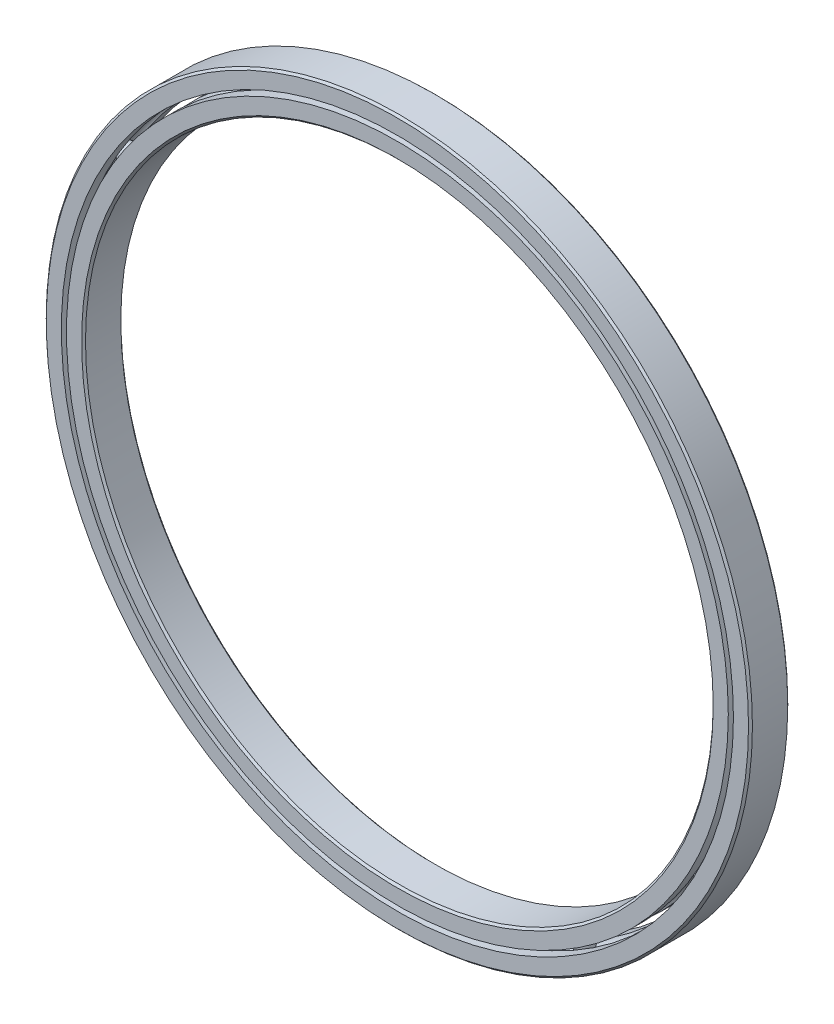
ISO-10303-21;
HEADER;
FILE_DESCRIPTION(('STEP AP214'),'2;1');
FILE_NAME('part.step','',(''),(''),'','','');
FILE_SCHEMA(('AUTOMOTIVE_DESIGN { 1 0 10303 214 1 1 1 1 }'));
ENDSEC;
DATA;
#1=APPLICATION_CONTEXT('core data for automotive mechanical design processes');
#2=APPLICATION_PROTOCOL_DEFINITION('international standard','automotive_design',2000,#1);
#3=PRODUCT_CONTEXT('',#1,'mechanical');
#4=PRODUCT('Part','Part','',(#3));
#5=PRODUCT_RELATED_PRODUCT_CATEGORY('part','',(#4));
#6=PRODUCT_DEFINITION_FORMATION('','',#4);
#7=PRODUCT_DEFINITION_CONTEXT('part definition',#1,'design');
#8=PRODUCT_DEFINITION('design','',#6,#7);
#9=PRODUCT_DEFINITION_SHAPE('','',#8);
#10=(LENGTH_UNIT() NAMED_UNIT(*) SI_UNIT(.MILLI.,.METRE.));
#11=(NAMED_UNIT(*) PLANE_ANGLE_UNIT() SI_UNIT($,.RADIAN.));
#12=(NAMED_UNIT(*) SI_UNIT($,.STERADIAN.) SOLID_ANGLE_UNIT());
#13=UNCERTAINTY_MEASURE_WITH_UNIT(LENGTH_MEASURE(1.E-05),#10,'distance_accuracy_value','');
#14=(GEOMETRIC_REPRESENTATION_CONTEXT(3) GLOBAL_UNCERTAINTY_ASSIGNED_CONTEXT((#13)) GLOBAL_UNIT_ASSIGNED_CONTEXT((#10,
#11,#12)) REPRESENTATION_CONTEXT('',''));
#15=CARTESIAN_POINT('',(0.,0.,0.));
#16=DIRECTION('',(0.,0.,1.));
#17=DIRECTION('',(1.,0.,0.));
#18=AXIS2_PLACEMENT_3D('',#15,#16,#17);
#19=CARTESIAN_POINT('',(-26.9874999999994,46.7437211692654,0.));
#20=DIRECTION('',(0.,0.,1.));
#21=DIRECTION('',(-0.499999999999989,0.866025403784445,0.));
#22=AXIS2_PLACEMENT_3D('',#19,#20,#21);
#23=SPHERICAL_SURFACE('',#22,1.47092461406698);
#24=CARTESIAN_POINT('',(-26.9874999999994,46.7437211692654,1.47092461406698));
#25=VERTEX_POINT('',#24);
#26=VERTEX_LOOP('',#25);
#27=FACE_BOUND('',#26,.T.);
#28=ADVANCED_FACE('F48',(#27),#23,.T.);
#29=CLOSED_SHELL('',(#28));
#30=MANIFOLD_SOLID_BREP('B2',#29);
#31=CARTESIAN_POINT('',(-46.7437211692648,26.9875000000005,0.));
#32=DIRECTION('',(0.,0.,1.));
#33=DIRECTION('',(-0.866025403784433,0.50000000000001,0.));
#34=AXIS2_PLACEMENT_3D('',#31,#32,#33);
#35=SPHERICAL_SURFACE('',#34,1.47092461406698);
#36=CARTESIAN_POINT('',(-46.7437211692648,26.9875000000005,1.47092461406698));
#37=VERTEX_POINT('',#36);
#38=VERTEX_LOOP('',#37);
#39=FACE_BOUND('',#38,.T.);
#40=ADVANCED_FACE('F69',(#39),#35,.T.);
#41=CLOSED_SHELL('',(#40));
#42=MANIFOLD_SOLID_BREP('B6',#41);
#43=CARTESIAN_POINT('',(-53.975,5.65358115792174E-13,0.));
#44=DIRECTION('',(0.,0.,1.));
#45=DIRECTION('',(-1.,0.,0.));
#46=AXIS2_PLACEMENT_3D('',#43,#44,#45);
#47=SPHERICAL_SURFACE('',#46,1.47092461406698);
#48=CARTESIAN_POINT('',(-53.975,5.65358115792174E-13,1.47092461406698));
#49=VERTEX_POINT('',#48);
#50=VERTEX_LOOP('',#49);
#51=FACE_BOUND('',#50,.T.);
#52=ADVANCED_FACE('F90',(#51),#47,.T.);
#53=CLOSED_SHELL('',(#52));
#54=MANIFOLD_SOLID_BREP('B44',#53);
#55=CARTESIAN_POINT('',(-46.7437211692653,-26.9874999999996,0.));
#56=DIRECTION('',(0.,0.,1.));
#57=DIRECTION('',(-0.866025403784443,-0.499999999999992,0.));
#58=AXIS2_PLACEMENT_3D('',#55,#56,#57);
#59=SPHERICAL_SURFACE('',#58,1.47092461406698);
#60=CARTESIAN_POINT('',(-46.7437211692653,-26.9874999999996,1.47092461406698));
#61=VERTEX_POINT('',#60);
#62=VERTEX_LOOP('',#61);
#63=FACE_BOUND('',#62,.T.);
#64=ADVANCED_FACE('F111',(#63),#59,.T.);
#65=CLOSED_SHELL('',(#64));
#66=MANIFOLD_SOLID_BREP('B65',#65);
#67=CARTESIAN_POINT('',(-26.9875000000004,-46.7437211692649,0.));
#68=DIRECTION('',(0.,0.,1.));
#69=DIRECTION('',(-0.500000000000007,-0.866025403784435,0.));
#70=AXIS2_PLACEMENT_3D('',#67,#68,#69);
#71=SPHERICAL_SURFACE('',#70,1.47092461406698);
#72=CARTESIAN_POINT('',(-26.9875000000004,-46.7437211692649,1.47092461406698));
#73=VERTEX_POINT('',#72);
#74=VERTEX_LOOP('',#73);
#75=FACE_BOUND('',#74,.T.);
#76=ADVANCED_FACE('F132',(#75),#71,.T.);
#77=CLOSED_SHELL('',(#76));
#78=MANIFOLD_SOLID_BREP('B86',#77);
#79=CARTESIAN_POINT('',(-3.76905410528116E-13,-53.975,0.));
#80=DIRECTION('',(0.,0.,1.));
#81=DIRECTION('',(0.,-1.,0.));
#82=AXIS2_PLACEMENT_3D('',#79,#80,#81);
#83=SPHERICAL_SURFACE('',#82,1.47092461406698);
#84=CARTESIAN_POINT('',(-3.76905410528116E-13,-53.975,1.47092461406698));
#85=VERTEX_POINT('',#84);
#86=VERTEX_LOOP('',#85);
#87=FACE_BOUND('',#86,.T.);
#88=ADVANCED_FACE('F153',(#87),#83,.T.);
#89=CLOSED_SHELL('',(#88));
#90=MANIFOLD_SOLID_BREP('B107',#89);
#91=CARTESIAN_POINT('',(26.9874999999997,-46.7437211692652,0.));
#92=DIRECTION('',(0.,0.,1.));
#93=DIRECTION('',(0.499999999999995,-0.866025403784442,0.));
#94=AXIS2_PLACEMENT_3D('',#91,#92,#93);
#95=SPHERICAL_SURFACE('',#94,1.47092461406698);
#96=CARTESIAN_POINT('',(26.9874999999997,-46.7437211692652,1.47092461406698));
#97=VERTEX_POINT('',#96);
#98=VERTEX_LOOP('',#97);
#99=FACE_BOUND('',#98,.T.);
#100=ADVANCED_FACE('F174',(#99),#95,.T.);
#101=CLOSED_SHELL('',(#100));
#102=MANIFOLD_SOLID_BREP('B128',#101);
#103=CARTESIAN_POINT('',(46.743721169265,-26.9875000000002,0.));
#104=DIRECTION('',(0.,0.,1.));
#105=DIRECTION('',(0.866025403784436,-0.500000000000004,0.));
#106=AXIS2_PLACEMENT_3D('',#103,#104,#105);
#107=SPHERICAL_SURFACE('',#106,1.47092461406698);
#108=CARTESIAN_POINT('',(46.743721169265,-26.9875000000002,1.47092461406698));
#109=VERTEX_POINT('',#108);
#110=VERTEX_LOOP('',#109);
#111=FACE_BOUND('',#110,.T.);
#112=ADVANCED_FACE('F195',(#111),#107,.T.);
#113=CLOSED_SHELL('',(#112));
#114=MANIFOLD_SOLID_BREP('B149',#113);
#115=CARTESIAN_POINT('',(53.975,-1.88452705264058E-13,0.));
#116=DIRECTION('',(0.,0.,1.));
#117=DIRECTION('',(1.,0.,0.));
#118=AXIS2_PLACEMENT_3D('',#115,#116,#117);
#119=SPHERICAL_SURFACE('',#118,1.47092461406698);
#120=CARTESIAN_POINT('',(53.975,-1.88452705264058E-13,1.47092461406698));
#121=VERTEX_POINT('',#120);
#122=VERTEX_LOOP('',#121);
#123=FACE_BOUND('',#122,.T.);
#124=ADVANCED_FACE('F216',(#123),#119,.T.);
#125=CLOSED_SHELL('',(#124));
#126=MANIFOLD_SOLID_BREP('B170',#125);
#127=CARTESIAN_POINT('',(46.7437211692651,26.9874999999999,0.));
#128=DIRECTION('',(0.,0.,1.));
#129=DIRECTION('',(0.86602540378444,0.499999999999998,0.));
#130=AXIS2_PLACEMENT_3D('',#127,#128,#129);
#131=SPHERICAL_SURFACE('',#130,1.47092461406698);
#132=CARTESIAN_POINT('',(46.7437211692651,26.9874999999999,1.47092461406698));
#133=VERTEX_POINT('',#132);
#134=VERTEX_LOOP('',#133);
#135=FACE_BOUND('',#134,.T.);
#136=ADVANCED_FACE('F237',(#135),#131,.T.);
#137=CLOSED_SHELL('',(#136));
#138=MANIFOLD_SOLID_BREP('B191',#137);
#139=CARTESIAN_POINT('',(26.9875000000001,46.743721169265,0.));
#140=DIRECTION('',(0.,0.,1.));
#141=DIRECTION('',(0.500000000000001,0.866025403784438,0.));
#142=AXIS2_PLACEMENT_3D('',#139,#140,#141);
#143=SPHERICAL_SURFACE('',#142,1.47092461406698);
#144=CARTESIAN_POINT('',(26.9875000000001,46.743721169265,1.47092461406698));
#145=VERTEX_POINT('',#144);
#146=VERTEX_LOOP('',#145);
#147=FACE_BOUND('',#146,.T.);
#148=ADVANCED_FACE('F258',(#147),#143,.T.);
#149=CLOSED_SHELL('',(#148));
#150=MANIFOLD_SOLID_BREP('B212',#149);
#151=CARTESIAN_POINT('',(0.,53.975,0.));
#152=DIRECTION('',(0.,0.,1.));
#153=DIRECTION('',(0.,1.,0.));
#154=AXIS2_PLACEMENT_3D('',#151,#152,#153);
#155=SPHERICAL_SURFACE('',#154,1.47092461406698);
#156=CARTESIAN_POINT('',(0.,53.975,1.47092461406698));
#157=VERTEX_POINT('',#156);
#158=VERTEX_LOOP('',#157);
#159=FACE_BOUND('',#158,.T.);
#160=ADVANCED_FACE('F281',(#159),#155,.T.);
#161=CLOSED_SHELL('',(#160));
#162=MANIFOLD_SOLID_BREP('B233',#161);
#163=CARTESIAN_POINT('',(0.,53.5598076923077,3.17500000000001));
#164=DIRECTION('',(0.,0.,-1.));
#165=DIRECTION('',(-1.,0.,0.));
#166=AXIS2_PLACEMENT_3D('',#163,#164,#165);
#167=PLANE('',#166);
#168=CARTESIAN_POINT('',(0.,0.,3.17500000000001));
#169=DIRECTION('',(0.,0.,1.));
#170=DIRECTION('',(1.,0.,0.));
#171=AXIS2_PLACEMENT_3D('',#168,#169,#170);
#172=CIRCLE('',#171,51.1175);
#173=CARTESIAN_POINT('',(51.1175,0.,3.17500000000001));
#174=VERTEX_POINT('',#173);
#175=EDGE_CURVE('E338',#174,#174,#172,.T.);
#176=ORIENTED_EDGE('',*,*,#175,.F.);
#177=EDGE_LOOP('',(#176));
#178=FACE_BOUND('',#177,.T.);
#179=CARTESIAN_POINT('',(0.,0.,3.17500000000001));
#180=DIRECTION('',(0.,0.,1.));
#181=DIRECTION('',(1.,0.,0.));
#182=AXIS2_PLACEMENT_3D('',#179,#180,#181);
#183=CIRCLE('',#182,53.5598076923077);
#184=CARTESIAN_POINT('',(53.5598076923077,0.,3.17500000000001));
#185=VERTEX_POINT('',#184);
#186=EDGE_CURVE('E280',#185,#185,#183,.T.);
#187=ORIENTED_EDGE('',*,*,#186,.T.);
#188=EDGE_LOOP('',(#187));
#189=FACE_BOUND('',#188,.T.);
#190=ADVANCED_FACE('F301',(#178,#189),#167,.F.);
#191=CARTESIAN_POINT('',(0.,0.,3.175));
#192=DIRECTION('',(0.,0.,1.));
#193=DIRECTION('',(1.,0.,0.));
#194=AXIS2_PLACEMENT_3D('',#191,#192,#193);
#195=CYLINDRICAL_SURFACE('',#194,53.5598076923077);
#196=ORIENTED_EDGE('',*,*,#186,.F.);
#197=EDGE_LOOP('',(#196));
#198=FACE_BOUND('',#197,.T.);
#199=CARTESIAN_POINT('',(0.,0.,1.41111111111111));
#200=DIRECTION('',(0.,0.,1.));
#201=DIRECTION('',(1.,0.,0.));
#202=AXIS2_PLACEMENT_3D('',#199,#200,#201);
#203=CIRCLE('',#202,53.5598076923077);
#204=CARTESIAN_POINT('',(53.5598076923077,0.,1.41111111111111));
#205=VERTEX_POINT('',#204);
#206=EDGE_CURVE('E308',#205,#205,#203,.T.);
#207=ORIENTED_EDGE('',*,*,#206,.T.);
#208=EDGE_LOOP('',(#207));
#209=FACE_BOUND('',#208,.T.);
#210=ADVANCED_FACE('F347',(#198,#209),#195,.T.);
#211=CARTESIAN_POINT('',(0.,0.,0.));
#212=DIRECTION('',(0.,0.,1.));
#213=DIRECTION('',(1.,0.,0.));
#214=AXIS2_PLACEMENT_3D('',#211,#212,#213);
#215=TOROIDAL_SURFACE('',#214,53.975,1.47092461406697);
#216=ORIENTED_EDGE('',*,*,#206,.F.);
#217=EDGE_LOOP('',(#216));
#218=FACE_BOUND('',#217,.T.);
#219=CARTESIAN_POINT('',(0.,0.,-1.41111111111112));
#220=DIRECTION('',(0.,0.,1.));
#221=DIRECTION('',(1.,0.,0.));
#222=AXIS2_PLACEMENT_3D('',#219,#220,#221);
#223=CIRCLE('',#222,53.5598076923077);
#224=CARTESIAN_POINT('',(53.5598076923077,0.,-1.41111111111112));
#225=VERTEX_POINT('',#224);
#226=EDGE_CURVE('E314',#225,#225,#223,.T.);
#227=ORIENTED_EDGE('',*,*,#226,.T.);
#228=EDGE_LOOP('',(#227));
#229=FACE_BOUND('',#228,.T.);
#230=ADVANCED_FACE('F351',(#218,#229),#215,.F.);
#231=CARTESIAN_POINT('',(0.,0.,3.175));
#232=DIRECTION('',(0.,0.,1.));
#233=DIRECTION('',(1.,0.,0.));
#234=AXIS2_PLACEMENT_3D('',#231,#232,#233);
#235=CYLINDRICAL_SURFACE('',#234,53.5598076923077);
#236=ORIENTED_EDGE('',*,*,#226,.F.);
#237=EDGE_LOOP('',(#236));
#238=FACE_BOUND('',#237,.T.);
#239=CARTESIAN_POINT('',(0.,0.,-3.17500000000001));
#240=DIRECTION('',(0.,0.,1.));
#241=DIRECTION('',(1.,0.,0.));
#242=AXIS2_PLACEMENT_3D('',#239,#240,#241);
#243=CIRCLE('',#242,53.5598076923077);
#244=CARTESIAN_POINT('',(53.5598076923077,0.,-3.17500000000001));
#245=VERTEX_POINT('',#244);
#246=EDGE_CURVE('E320',#245,#245,#243,.T.);
#247=ORIENTED_EDGE('',*,*,#246,.T.);
#248=EDGE_LOOP('',(#247));
#249=FACE_BOUND('',#248,.T.);
#250=ADVANCED_FACE('F356',(#238,#249),#235,.T.);
#251=CARTESIAN_POINT('',(0.,51.1175,-3.17500000000001));
#252=DIRECTION('',(0.,0.,1.));
#253=DIRECTION('',(1.,0.,0.));
#254=AXIS2_PLACEMENT_3D('',#251,#252,#253);
#255=PLANE('',#254);
#256=ORIENTED_EDGE('',*,*,#246,.F.);
#257=EDGE_LOOP('',(#256));
#258=FACE_BOUND('',#257,.T.);
#259=CARTESIAN_POINT('',(0.,0.,-3.17500000000001));
#260=DIRECTION('',(0.,0.,1.));
#261=DIRECTION('',(1.,0.,0.));
#262=AXIS2_PLACEMENT_3D('',#259,#260,#261);
#263=CIRCLE('',#262,51.1175);
#264=CARTESIAN_POINT('',(51.1175,0.,-3.17500000000001));
#265=VERTEX_POINT('',#264);
#266=EDGE_CURVE('E326',#265,#265,#263,.T.);
#267=ORIENTED_EDGE('',*,*,#266,.T.);
#268=EDGE_LOOP('',(#267));
#269=FACE_BOUND('',#268,.T.);
#270=ADVANCED_FACE('F362',(#258,#269),#255,.F.);
#271=CARTESIAN_POINT('',(0.,0.,-2.85750000000001));
#272=DIRECTION('',(0.,0.,-1.));
#273=DIRECTION('',(-1.,0.,0.));
#274=AXIS2_PLACEMENT_3D('',#271,#272,#273);
#275=CONICAL_SURFACE('',#274,50.8,0.785398163397443);
#276=ORIENTED_EDGE('',*,*,#266,.F.);
#277=EDGE_LOOP('',(#276));
#278=FACE_BOUND('',#277,.T.);
#279=CARTESIAN_POINT('',(0.,0.,-2.85750000000001));
#280=DIRECTION('',(0.,0.,1.));
#281=DIRECTION('',(1.,0.,0.));
#282=AXIS2_PLACEMENT_3D('',#279,#280,#281);
#283=CIRCLE('',#282,50.8);
#284=CARTESIAN_POINT('',(50.8,0.,-2.85750000000001));
#285=VERTEX_POINT('',#284);
#286=EDGE_CURVE('E330',#285,#285,#283,.T.);
#287=ORIENTED_EDGE('',*,*,#286,.T.);
#288=EDGE_LOOP('',(#287));
#289=FACE_BOUND('',#288,.T.);
#290=ADVANCED_FACE('F366',(#278,#289),#275,.F.);
#291=CARTESIAN_POINT('',(0.,0.,3.175));
#292=DIRECTION('',(0.,0.,1.));
#293=DIRECTION('',(1.,0.,0.));
#294=AXIS2_PLACEMENT_3D('',#291,#292,#293);
#295=CYLINDRICAL_SURFACE('',#294,50.8);
#296=ORIENTED_EDGE('',*,*,#286,.F.);
#297=EDGE_LOOP('',(#296));
#298=FACE_BOUND('',#297,.T.);
#299=CARTESIAN_POINT('',(0.,0.,2.85750000000002));
#300=DIRECTION('',(0.,0.,1.));
#301=DIRECTION('',(1.,0.,0.));
#302=AXIS2_PLACEMENT_3D('',#299,#300,#301);
#303=CIRCLE('',#302,50.8);
#304=CARTESIAN_POINT('',(50.8,0.,2.85750000000002));
#305=VERTEX_POINT('',#304);
#306=EDGE_CURVE('E334',#305,#305,#303,.T.);
#307=ORIENTED_EDGE('',*,*,#306,.T.);
#308=EDGE_LOOP('',(#307));
#309=FACE_BOUND('',#308,.T.);
#310=ADVANCED_FACE('F370',(#298,#309),#295,.F.);
#311=CARTESIAN_POINT('',(0.,0.,3.17500000000001));
#312=DIRECTION('',(0.,0.,1.));
#313=DIRECTION('',(1.,0.,0.));
#314=AXIS2_PLACEMENT_3D('',#311,#312,#313);
#315=CONICAL_SURFACE('',#314,51.1175,0.785398163397483);
#316=ORIENTED_EDGE('',*,*,#306,.F.);
#317=EDGE_LOOP('',(#316));
#318=FACE_BOUND('',#317,.T.);
#319=ORIENTED_EDGE('',*,*,#175,.T.);
#320=EDGE_LOOP('',(#319));
#321=FACE_BOUND('',#320,.T.);
#322=ADVANCED_FACE('F344',(#318,#321),#315,.F.);
#323=CLOSED_SHELL('',(#190,#210,#230,#250,#270,#290,#310,#322));
#324=MANIFOLD_SOLID_BREP('B254',#323);
#325=CARTESIAN_POINT('',(0.,0.,2.85750000000001));
#326=DIRECTION('',(0.,0.,-1.));
#327=DIRECTION('',(-1.,0.,0.));
#328=AXIS2_PLACEMENT_3D('',#325,#326,#327);
#329=CONICAL_SURFACE('',#328,57.15,0.785398163397446);
#330=CARTESIAN_POINT('',(0.,0.,3.17500000000001));
#331=DIRECTION('',(0.,0.,1.));
#332=DIRECTION('',(1.,0.,0.));
#333=AXIS2_PLACEMENT_3D('',#330,#331,#332);
#334=CIRCLE('',#333,56.8325);
#335=CARTESIAN_POINT('',(56.8325,0.,3.17500000000001));
#336=VERTEX_POINT('',#335);
#337=EDGE_CURVE('E476',#336,#336,#334,.T.);
#338=ORIENTED_EDGE('',*,*,#337,.F.);
#339=EDGE_LOOP('',(#338));
#340=FACE_BOUND('',#339,.T.);
#341=CARTESIAN_POINT('',(0.,0.,2.85750000000001));
#342=DIRECTION('',(0.,0.,1.));
#343=DIRECTION('',(1.,0.,0.));
#344=AXIS2_PLACEMENT_3D('',#341,#342,#343);
#345=CIRCLE('',#344,57.15);
#346=CARTESIAN_POINT('',(57.15,0.,2.85750000000001));
#347=VERTEX_POINT('',#346);
#348=EDGE_CURVE('E300',#347,#347,#345,.T.);
#349=ORIENTED_EDGE('',*,*,#348,.T.);
#350=EDGE_LOOP('',(#349));
#351=FACE_BOUND('',#350,.T.);
#352=ADVANCED_FACE('F439',(#340,#351),#329,.T.);
#353=CARTESIAN_POINT('',(0.,0.,3.175));
#354=DIRECTION('',(0.,0.,1.));
#355=DIRECTION('',(1.,0.,0.));
#356=AXIS2_PLACEMENT_3D('',#353,#354,#355);
#357=CYLINDRICAL_SURFACE('',#356,57.15);
#358=ORIENTED_EDGE('',*,*,#348,.F.);
#359=EDGE_LOOP('',(#358));
#360=FACE_BOUND('',#359,.T.);
#361=CARTESIAN_POINT('',(0.,0.,-2.85750000000001));
#362=DIRECTION('',(0.,0.,1.));
#363=DIRECTION('',(1.,0.,0.));
#364=AXIS2_PLACEMENT_3D('',#361,#362,#363);
#365=CIRCLE('',#364,57.15);
#366=CARTESIAN_POINT('',(57.15,0.,-2.85750000000001));
#367=VERTEX_POINT('',#366);
#368=EDGE_CURVE('E446',#367,#367,#365,.T.);
#369=ORIENTED_EDGE('',*,*,#368,.T.);
#370=EDGE_LOOP('',(#369));
#371=FACE_BOUND('',#370,.T.);
#372=ADVANCED_FACE('F485',(#360,#371),#357,.T.);
#373=CARTESIAN_POINT('',(0.,0.,-3.17500000000001));
#374=DIRECTION('',(0.,0.,1.));
#375=DIRECTION('',(1.,0.,0.));
#376=AXIS2_PLACEMENT_3D('',#373,#374,#375);
#377=CONICAL_SURFACE('',#376,56.8325,0.785398163397444);
#378=ORIENTED_EDGE('',*,*,#368,.F.);
#379=EDGE_LOOP('',(#378));
#380=FACE_BOUND('',#379,.T.);
#381=CARTESIAN_POINT('',(0.,0.,-3.17500000000001));
#382=DIRECTION('',(0.,0.,1.));
#383=DIRECTION('',(1.,0.,0.));
#384=AXIS2_PLACEMENT_3D('',#381,#382,#383);
#385=CIRCLE('',#384,56.8325);
#386=CARTESIAN_POINT('',(56.8325,0.,-3.17500000000001));
#387=VERTEX_POINT('',#386);
#388=EDGE_CURVE('E452',#387,#387,#385,.T.);
#389=ORIENTED_EDGE('',*,*,#388,.T.);
#390=EDGE_LOOP('',(#389));
#391=FACE_BOUND('',#390,.T.);
#392=ADVANCED_FACE('F489',(#380,#391),#377,.T.);
#393=CARTESIAN_POINT('',(0.,56.8325,-3.17500000000001));
#394=DIRECTION('',(0.,0.,1.));
#395=DIRECTION('',(1.,0.,0.));
#396=AXIS2_PLACEMENT_3D('',#393,#394,#395);
#397=PLANE('',#396);
#398=ORIENTED_EDGE('',*,*,#388,.F.);
#399=EDGE_LOOP('',(#398));
#400=FACE_BOUND('',#399,.T.);
#401=CARTESIAN_POINT('',(0.,0.,-3.17500000000001));
#402=DIRECTION('',(0.,0.,1.));
#403=DIRECTION('',(1.,0.,0.));
#404=AXIS2_PLACEMENT_3D('',#401,#402,#403);
#405=CIRCLE('',#404,54.3901923076923);
#406=CARTESIAN_POINT('',(54.3901923076923,0.,-3.17500000000001));
#407=VERTEX_POINT('',#406);
#408=EDGE_CURVE('E458',#407,#407,#405,.T.);
#409=ORIENTED_EDGE('',*,*,#408,.T.);
#410=EDGE_LOOP('',(#409));
#411=FACE_BOUND('',#410,.T.);
#412=ADVANCED_FACE('F494',(#400,#411),#397,.F.);
#413=CARTESIAN_POINT('',(0.,0.,3.175));
#414=DIRECTION('',(0.,0.,1.));
#415=DIRECTION('',(1.,0.,0.));
#416=AXIS2_PLACEMENT_3D('',#413,#414,#415);
#417=CYLINDRICAL_SURFACE('',#416,54.3901923076923);
#418=ORIENTED_EDGE('',*,*,#408,.F.);
#419=EDGE_LOOP('',(#418));
#420=FACE_BOUND('',#419,.T.);
#421=CARTESIAN_POINT('',(0.,0.,-1.41111111111111));
#422=DIRECTION('',(0.,0.,1.));
#423=DIRECTION('',(1.,0.,0.));
#424=AXIS2_PLACEMENT_3D('',#421,#422,#423);
#425=CIRCLE('',#424,54.3901923076923);
#426=CARTESIAN_POINT('',(54.3901923076923,0.,-1.41111111111111));
#427=VERTEX_POINT('',#426);
#428=EDGE_CURVE('E464',#427,#427,#425,.T.);
#429=ORIENTED_EDGE('',*,*,#428,.T.);
#430=EDGE_LOOP('',(#429));
#431=FACE_BOUND('',#430,.T.);
#432=ADVANCED_FACE('F500',(#420,#431),#417,.F.);
#433=CARTESIAN_POINT('',(0.,0.,0.));
#434=DIRECTION('',(0.,0.,1.));
#435=DIRECTION('',(1.,0.,0.));
#436=AXIS2_PLACEMENT_3D('',#433,#434,#435);
#437=TOROIDAL_SURFACE('',#436,53.975,1.47092461406698);
#438=ORIENTED_EDGE('',*,*,#428,.F.);
#439=EDGE_LOOP('',(#438));
#440=FACE_BOUND('',#439,.T.);
#441=CARTESIAN_POINT('',(0.,0.,1.41111111111111));
#442=DIRECTION('',(0.,0.,1.));
#443=DIRECTION('',(1.,0.,0.));
#444=AXIS2_PLACEMENT_3D('',#441,#442,#443);
#445=CIRCLE('',#444,54.3901923076923);
#446=CARTESIAN_POINT('',(54.3901923076923,0.,1.41111111111111));
#447=VERTEX_POINT('',#446);
#448=EDGE_CURVE('E468',#447,#447,#445,.T.);
#449=ORIENTED_EDGE('',*,*,#448,.T.);
#450=EDGE_LOOP('',(#449));
#451=FACE_BOUND('',#450,.T.);
#452=ADVANCED_FACE('F504',(#440,#451),#437,.F.);
#453=CARTESIAN_POINT('',(0.,0.,3.175));
#454=DIRECTION('',(0.,0.,1.));
#455=DIRECTION('',(1.,0.,0.));
#456=AXIS2_PLACEMENT_3D('',#453,#454,#455);
#457=CYLINDRICAL_SURFACE('',#456,54.3901923076923);
#458=ORIENTED_EDGE('',*,*,#448,.F.);
#459=EDGE_LOOP('',(#458));
#460=FACE_BOUND('',#459,.T.);
#461=CARTESIAN_POINT('',(0.,0.,3.17500000000001));
#462=DIRECTION('',(0.,0.,1.));
#463=DIRECTION('',(1.,0.,0.));
#464=AXIS2_PLACEMENT_3D('',#461,#462,#463);
#465=CIRCLE('',#464,54.3901923076923);
#466=CARTESIAN_POINT('',(54.3901923076923,0.,3.17500000000001));
#467=VERTEX_POINT('',#466);
#468=EDGE_CURVE('E472',#467,#467,#465,.T.);
#469=ORIENTED_EDGE('',*,*,#468,.T.);
#470=EDGE_LOOP('',(#469));
#471=FACE_BOUND('',#470,.T.);
#472=ADVANCED_FACE('F508',(#460,#471),#457,.F.);
#473=CARTESIAN_POINT('',(0.,56.8325,3.17500000000001));
#474=DIRECTION('',(0.,0.,-1.));
#475=DIRECTION('',(-1.,0.,0.));
#476=AXIS2_PLACEMENT_3D('',#473,#474,#475);
#477=PLANE('',#476);
#478=ORIENTED_EDGE('',*,*,#468,.F.);
#479=EDGE_LOOP('',(#478));
#480=FACE_BOUND('',#479,.T.);
#481=ORIENTED_EDGE('',*,*,#337,.T.);
#482=EDGE_LOOP('',(#481));
#483=FACE_BOUND('',#482,.T.);
#484=ADVANCED_FACE('F482',(#480,#483),#477,.F.);
#485=CLOSED_SHELL('',(#352,#372,#392,#412,#432,#452,#472,#484));
#486=MANIFOLD_SOLID_BREP('B275',#485);
#487=ADVANCED_BREP_SHAPE_REPRESENTATION('',(#18,#30,#42,#54,#66,#78,#90,#102,#114,#126,#138,
#150,#162,#324,#486),#14);
#488=SHAPE_DEFINITION_REPRESENTATION(#9,#487);
ENDSEC;
END-ISO-10303-21;
